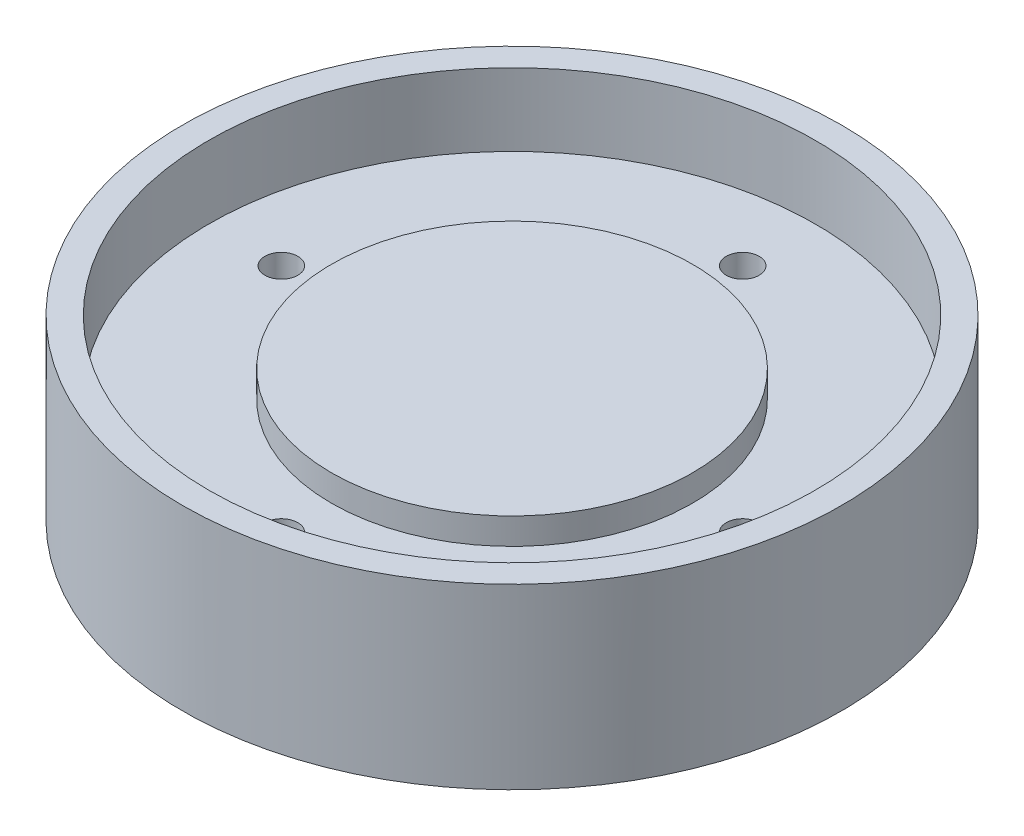
ISO-10303-21;
HEADER;
FILE_DESCRIPTION(('STEP AP214'),'2;1');
FILE_NAME('part.step','',(''),(''),'','','');
FILE_SCHEMA(('AUTOMOTIVE_DESIGN { 1 0 10303 214 1 1 1 1 }'));
ENDSEC;
DATA;
#1=APPLICATION_CONTEXT('core data for automotive mechanical design processes');
#2=APPLICATION_PROTOCOL_DEFINITION('international standard','automotive_design',2000,#1);
#3=PRODUCT_CONTEXT('',#1,'mechanical');
#4=PRODUCT('Part','Part','',(#3));
#5=PRODUCT_RELATED_PRODUCT_CATEGORY('part','',(#4));
#6=PRODUCT_DEFINITION_FORMATION('','',#4);
#7=PRODUCT_DEFINITION_CONTEXT('part definition',#1,'design');
#8=PRODUCT_DEFINITION('design','',#6,#7);
#9=PRODUCT_DEFINITION_SHAPE('','',#8);
#10=(LENGTH_UNIT() NAMED_UNIT(*) SI_UNIT(.MILLI.,.METRE.));
#11=(NAMED_UNIT(*) PLANE_ANGLE_UNIT() SI_UNIT($,.RADIAN.));
#12=(NAMED_UNIT(*) SI_UNIT($,.STERADIAN.) SOLID_ANGLE_UNIT());
#13=UNCERTAINTY_MEASURE_WITH_UNIT(LENGTH_MEASURE(1.E-05),#10,'distance_accuracy_value','');
#14=(GEOMETRIC_REPRESENTATION_CONTEXT(3) GLOBAL_UNCERTAINTY_ASSIGNED_CONTEXT((#13)) GLOBAL_UNIT_ASSIGNED_CONTEXT((#10,
#11,#12)) REPRESENTATION_CONTEXT('',''));
#15=CARTESIAN_POINT('',(0.,0.,0.));
#16=DIRECTION('',(0.,0.,1.));
#17=DIRECTION('',(1.,0.,0.));
#18=AXIS2_PLACEMENT_3D('',#15,#16,#17);
#19=CARTESIAN_POINT('',(0.,0.,0.));
#20=DIRECTION('',(0.,1.,0.));
#21=DIRECTION('',(0.,0.,1.));
#22=AXIS2_PLACEMENT_3D('',#19,#20,#21);
#23=PLANE('',#22);
#24=CARTESIAN_POINT('',(0.,0.,35.));
#25=DIRECTION('',(0.,1.,0.));
#26=DIRECTION('',(0.,0.,1.));
#27=AXIS2_PLACEMENT_3D('',#24,#25,#26);
#28=CIRCLE('',#27,2.5);
#29=CARTESIAN_POINT('',(0.,0.,37.5));
#30=VERTEX_POINT('',#29);
#31=EDGE_CURVE('E57',#30,#30,#28,.T.);
#32=ORIENTED_EDGE('',*,*,#31,.T.);
#33=EDGE_LOOP('',(#32));
#34=FACE_BOUND('',#33,.T.);
#35=CARTESIAN_POINT('',(0.,0.,-35.));
#36=DIRECTION('',(0.,1.,0.));
#37=DIRECTION('',(0.,0.,1.));
#38=AXIS2_PLACEMENT_3D('',#35,#36,#37);
#39=CIRCLE('',#38,2.5);
#40=CARTESIAN_POINT('',(0.,0.,-32.5));
#41=VERTEX_POINT('',#40);
#42=EDGE_CURVE('E61',#41,#41,#39,.T.);
#43=ORIENTED_EDGE('',*,*,#42,.T.);
#44=EDGE_LOOP('',(#43));
#45=FACE_BOUND('',#44,.T.);
#46=CARTESIAN_POINT('',(-35.,0.,0.));
#47=DIRECTION('',(0.,1.,0.));
#48=DIRECTION('',(0.,0.,1.));
#49=AXIS2_PLACEMENT_3D('',#46,#47,#48);
#50=CIRCLE('',#49,2.5);
#51=CARTESIAN_POINT('',(-35.,0.,2.5));
#52=VERTEX_POINT('',#51);
#53=EDGE_CURVE('E64',#52,#52,#50,.T.);
#54=ORIENTED_EDGE('',*,*,#53,.T.);
#55=EDGE_LOOP('',(#54));
#56=FACE_BOUND('',#55,.T.);
#57=CARTESIAN_POINT('',(35.,0.,0.));
#58=DIRECTION('',(0.,1.,0.));
#59=DIRECTION('',(0.,0.,1.));
#60=AXIS2_PLACEMENT_3D('',#57,#58,#59);
#61=CIRCLE('',#60,2.5);
#62=CARTESIAN_POINT('',(35.,0.,2.5));
#63=VERTEX_POINT('',#62);
#64=EDGE_CURVE('E76',#63,#63,#61,.T.);
#65=ORIENTED_EDGE('',*,*,#64,.T.);
#66=EDGE_LOOP('',(#65));
#67=FACE_BOUND('',#66,.T.);
#68=CARTESIAN_POINT('',(0.,0.,0.));
#69=DIRECTION('',(0.,-1.,0.));
#70=DIRECTION('',(0.,0.,-1.));
#71=AXIS2_PLACEMENT_3D('',#68,#69,#70);
#72=CIRCLE('',#71,48.);
#73=CARTESIAN_POINT('',(0.,0.,-48.));
#74=VERTEX_POINT('',#73);
#75=EDGE_CURVE('E119',#74,#74,#72,.T.);
#76=ORIENTED_EDGE('',*,*,#75,.T.);
#77=EDGE_LOOP('',(#76));
#78=FACE_BOUND('',#77,.T.);
#79=ADVANCED_FACE('F37',(#34,#45,#56,#67,#78),#23,.F.);
#80=CARTESIAN_POINT('',(0.,15.,0.));
#81=DIRECTION('',(0.,-1.,0.));
#82=DIRECTION('',(0.,0.,-1.));
#83=AXIS2_PLACEMENT_3D('',#80,#81,#82);
#84=CYLINDRICAL_SURFACE('',#83,50.);
#85=CARTESIAN_POINT('',(0.,15.,0.));
#86=DIRECTION('',(0.,1.,0.));
#87=DIRECTION('',(0.,0.,1.));
#88=AXIS2_PLACEMENT_3D('',#85,#86,#87);
#89=CIRCLE('',#88,50.);
#90=CARTESIAN_POINT('',(0.,15.,50.));
#91=VERTEX_POINT('',#90);
#92=EDGE_CURVE('E10',#91,#91,#89,.T.);
#93=ORIENTED_EDGE('',*,*,#92,.F.);
#94=EDGE_LOOP('',(#93));
#95=FACE_BOUND('',#94,.T.);
#96=CARTESIAN_POINT('',(0.,-12.,0.));
#97=DIRECTION('',(0.,-1.,0.));
#98=DIRECTION('',(0.,0.,-1.));
#99=AXIS2_PLACEMENT_3D('',#96,#97,#98);
#100=CIRCLE('',#99,50.);
#101=CARTESIAN_POINT('',(0.,-12.,-50.));
#102=VERTEX_POINT('',#101);
#103=EDGE_CURVE('E58',#102,#102,#100,.T.);
#104=ORIENTED_EDGE('',*,*,#103,.F.);
#105=EDGE_LOOP('',(#104));
#106=FACE_BOUND('',#105,.T.);
#107=ADVANCED_FACE('F39',(#95,#106),#84,.T.);
#108=CARTESIAN_POINT('',(0.,15.,0.));
#109=DIRECTION('',(0.,1.,0.));
#110=DIRECTION('',(0.,0.,1.));
#111=AXIS2_PLACEMENT_3D('',#108,#109,#110);
#112=PLANE('',#111);
#113=CARTESIAN_POINT('',(0.,15.,0.));
#114=DIRECTION('',(0.,1.,0.));
#115=DIRECTION('',(0.,0.,1.));
#116=AXIS2_PLACEMENT_3D('',#113,#114,#115);
#117=CIRCLE('',#116,46.);
#118=CARTESIAN_POINT('',(0.,15.,46.));
#119=VERTEX_POINT('',#118);
#120=EDGE_CURVE('E45',#119,#119,#117,.T.);
#121=ORIENTED_EDGE('',*,*,#120,.F.);
#122=EDGE_LOOP('',(#121));
#123=FACE_BOUND('',#122,.T.);
#124=ORIENTED_EDGE('',*,*,#92,.T.);
#125=EDGE_LOOP('',(#124));
#126=FACE_BOUND('',#125,.T.);
#127=ADVANCED_FACE('F91',(#123,#126),#112,.T.);
#128=CARTESIAN_POINT('',(0.,15.,0.));
#129=DIRECTION('',(0.,-1.,0.));
#130=DIRECTION('',(0.,0.,-1.));
#131=AXIS2_PLACEMENT_3D('',#128,#129,#130);
#132=CYLINDRICAL_SURFACE('',#131,46.);
#133=ORIENTED_EDGE('',*,*,#120,.T.);
#134=EDGE_LOOP('',(#133));
#135=FACE_BOUND('',#134,.T.);
#136=CARTESIAN_POINT('',(0.,4.,0.));
#137=DIRECTION('',(0.,1.,0.));
#138=DIRECTION('',(0.,0.,1.));
#139=AXIS2_PLACEMENT_3D('',#136,#137,#138);
#140=CIRCLE('',#139,46.);
#141=CARTESIAN_POINT('',(0.,4.,46.));
#142=VERTEX_POINT('',#141);
#143=EDGE_CURVE('E50',#142,#142,#140,.T.);
#144=ORIENTED_EDGE('',*,*,#143,.F.);
#145=EDGE_LOOP('',(#144));
#146=FACE_BOUND('',#145,.T.);
#147=ADVANCED_FACE('F89',(#135,#146),#132,.F.);
#148=CARTESIAN_POINT('',(0.,4.,0.));
#149=DIRECTION('',(0.,1.,0.));
#150=DIRECTION('',(0.,0.,1.));
#151=AXIS2_PLACEMENT_3D('',#148,#149,#150);
#152=PLANE('',#151);
#153=CARTESIAN_POINT('',(35.,4.,0.));
#154=DIRECTION('',(0.,1.,0.));
#155=DIRECTION('',(0.,0.,1.));
#156=AXIS2_PLACEMENT_3D('',#153,#154,#155);
#157=CIRCLE('',#156,2.5);
#158=CARTESIAN_POINT('',(35.,4.,2.5));
#159=VERTEX_POINT('',#158);
#160=EDGE_CURVE('E41',#159,#159,#157,.T.);
#161=ORIENTED_EDGE('',*,*,#160,.F.);
#162=EDGE_LOOP('',(#161));
#163=FACE_BOUND('',#162,.T.);
#164=CARTESIAN_POINT('',(-35.,4.,0.));
#165=DIRECTION('',(0.,1.,0.));
#166=DIRECTION('',(0.,0.,1.));
#167=AXIS2_PLACEMENT_3D('',#164,#165,#166);
#168=CIRCLE('',#167,2.5);
#169=CARTESIAN_POINT('',(-35.,4.,2.5));
#170=VERTEX_POINT('',#169);
#171=EDGE_CURVE('E62',#170,#170,#168,.T.);
#172=ORIENTED_EDGE('',*,*,#171,.F.);
#173=EDGE_LOOP('',(#172));
#174=FACE_BOUND('',#173,.T.);
#175=CARTESIAN_POINT('',(0.,4.,-35.));
#176=DIRECTION('',(0.,1.,0.));
#177=DIRECTION('',(0.,0.,1.));
#178=AXIS2_PLACEMENT_3D('',#175,#176,#177);
#179=CIRCLE('',#178,2.5);
#180=CARTESIAN_POINT('',(0.,4.,-32.5));
#181=VERTEX_POINT('',#180);
#182=EDGE_CURVE('E59',#181,#181,#179,.T.);
#183=ORIENTED_EDGE('',*,*,#182,.F.);
#184=EDGE_LOOP('',(#183));
#185=FACE_BOUND('',#184,.T.);
#186=CARTESIAN_POINT('',(0.,4.,35.));
#187=DIRECTION('',(0.,1.,0.));
#188=DIRECTION('',(0.,0.,1.));
#189=AXIS2_PLACEMENT_3D('',#186,#187,#188);
#190=CIRCLE('',#189,2.5);
#191=CARTESIAN_POINT('',(0.,4.,37.5));
#192=VERTEX_POINT('',#191);
#193=EDGE_CURVE('E54',#192,#192,#190,.T.);
#194=ORIENTED_EDGE('',*,*,#193,.F.);
#195=EDGE_LOOP('',(#194));
#196=FACE_BOUND('',#195,.T.);
#197=CARTESIAN_POINT('',(0.,4.,0.));
#198=DIRECTION('',(0.,1.,0.));
#199=DIRECTION('',(0.,0.,1.));
#200=AXIS2_PLACEMENT_3D('',#197,#198,#199);
#201=CIRCLE('',#200,27.405);
#202=CARTESIAN_POINT('',(0.,4.,27.405));
#203=VERTEX_POINT('',#202);
#204=EDGE_CURVE('E79',#203,#203,#201,.T.);
#205=ORIENTED_EDGE('',*,*,#204,.F.);
#206=EDGE_LOOP('',(#205));
#207=FACE_BOUND('',#206,.T.);
#208=ORIENTED_EDGE('',*,*,#143,.T.);
#209=EDGE_LOOP('',(#208));
#210=FACE_BOUND('',#209,.T.);
#211=ADVANCED_FACE('F87',(#163,#174,#185,#196,#207,#210),#152,.T.);
#212=CARTESIAN_POINT('',(0.,8.,0.));
#213=DIRECTION('',(0.,-1.,0.));
#214=DIRECTION('',(0.,0.,-1.));
#215=AXIS2_PLACEMENT_3D('',#212,#213,#214);
#216=CYLINDRICAL_SURFACE('',#215,27.405);
#217=CARTESIAN_POINT('',(0.,8.,0.));
#218=DIRECTION('',(0.,1.,0.));
#219=DIRECTION('',(0.,0.,1.));
#220=AXIS2_PLACEMENT_3D('',#217,#218,#219);
#221=CIRCLE('',#220,27.405);
#222=CARTESIAN_POINT('',(0.,8.,27.405));
#223=VERTEX_POINT('',#222);
#224=EDGE_CURVE('E80',#223,#223,#221,.T.);
#225=ORIENTED_EDGE('',*,*,#224,.F.);
#226=EDGE_LOOP('',(#225));
#227=FACE_BOUND('',#226,.T.);
#228=ORIENTED_EDGE('',*,*,#204,.T.);
#229=EDGE_LOOP('',(#228));
#230=FACE_BOUND('',#229,.T.);
#231=ADVANCED_FACE('F98',(#227,#230),#216,.T.);
#232=CARTESIAN_POINT('',(0.,8.,0.));
#233=DIRECTION('',(0.,1.,0.));
#234=DIRECTION('',(0.,0.,1.));
#235=AXIS2_PLACEMENT_3D('',#232,#233,#234);
#236=PLANE('',#235);
#237=ORIENTED_EDGE('',*,*,#224,.T.);
#238=EDGE_LOOP('',(#237));
#239=FACE_BOUND('',#238,.T.);
#240=ADVANCED_FACE('F155',(#239),#236,.T.);
#241=CARTESIAN_POINT('',(0.,-4.,35.));
#242=DIRECTION('',(0.,1.,0.));
#243=DIRECTION('',(0.,0.,1.));
#244=AXIS2_PLACEMENT_3D('',#241,#242,#243);
#245=CYLINDRICAL_SURFACE('',#244,2.5);
#246=ORIENTED_EDGE('',*,*,#193,.T.);
#247=EDGE_LOOP('',(#246));
#248=FACE_BOUND('',#247,.T.);
#249=ORIENTED_EDGE('',*,*,#31,.F.);
#250=EDGE_LOOP('',(#249));
#251=FACE_BOUND('',#250,.T.);
#252=ADVANCED_FACE('F151',(#248,#251),#245,.F.);
#253=CARTESIAN_POINT('',(0.,-4.,-35.));
#254=DIRECTION('',(0.,1.,0.));
#255=DIRECTION('',(0.,0.,1.));
#256=AXIS2_PLACEMENT_3D('',#253,#254,#255);
#257=CYLINDRICAL_SURFACE('',#256,2.5);
#258=ORIENTED_EDGE('',*,*,#182,.T.);
#259=EDGE_LOOP('',(#258));
#260=FACE_BOUND('',#259,.T.);
#261=ORIENTED_EDGE('',*,*,#42,.F.);
#262=EDGE_LOOP('',(#261));
#263=FACE_BOUND('',#262,.T.);
#264=ADVANCED_FACE('F148',(#260,#263),#257,.F.);
#265=CARTESIAN_POINT('',(-35.,-4.,0.));
#266=DIRECTION('',(0.,1.,0.));
#267=DIRECTION('',(0.,0.,1.));
#268=AXIS2_PLACEMENT_3D('',#265,#266,#267);
#269=CYLINDRICAL_SURFACE('',#268,2.5);
#270=ORIENTED_EDGE('',*,*,#171,.T.);
#271=EDGE_LOOP('',(#270));
#272=FACE_BOUND('',#271,.T.);
#273=ORIENTED_EDGE('',*,*,#53,.F.);
#274=EDGE_LOOP('',(#273));
#275=FACE_BOUND('',#274,.T.);
#276=ADVANCED_FACE('F144',(#272,#275),#269,.F.);
#277=CARTESIAN_POINT('',(35.,-4.,0.));
#278=DIRECTION('',(0.,1.,0.));
#279=DIRECTION('',(0.,0.,1.));
#280=AXIS2_PLACEMENT_3D('',#277,#278,#279);
#281=CYLINDRICAL_SURFACE('',#280,2.5);
#282=ORIENTED_EDGE('',*,*,#160,.T.);
#283=EDGE_LOOP('',(#282));
#284=FACE_BOUND('',#283,.T.);
#285=ORIENTED_EDGE('',*,*,#64,.F.);
#286=EDGE_LOOP('',(#285));
#287=FACE_BOUND('',#286,.T.);
#288=ADVANCED_FACE('F133',(#284,#287),#281,.F.);
#289=CARTESIAN_POINT('',(0.,-12.,0.));
#290=DIRECTION('',(0.,-1.,0.));
#291=DIRECTION('',(0.,0.,-1.));
#292=AXIS2_PLACEMENT_3D('',#289,#290,#291);
#293=PLANE('',#292);
#294=ORIENTED_EDGE('',*,*,#103,.T.);
#295=EDGE_LOOP('',(#294));
#296=FACE_BOUND('',#295,.T.);
#297=CARTESIAN_POINT('',(0.,-12.,0.));
#298=DIRECTION('',(0.,-1.,0.));
#299=DIRECTION('',(0.,0.,-1.));
#300=AXIS2_PLACEMENT_3D('',#297,#298,#299);
#301=CIRCLE('',#300,48.);
#302=CARTESIAN_POINT('',(0.,-12.,-48.));
#303=VERTEX_POINT('',#302);
#304=EDGE_CURVE('E121',#303,#303,#301,.T.);
#305=ORIENTED_EDGE('',*,*,#304,.F.);
#306=EDGE_LOOP('',(#305));
#307=FACE_BOUND('',#306,.T.);
#308=ADVANCED_FACE('F128',(#296,#307),#293,.T.);
#309=CARTESIAN_POINT('',(0.,-12.,0.));
#310=DIRECTION('',(0.,1.,0.));
#311=DIRECTION('',(0.,0.,1.));
#312=AXIS2_PLACEMENT_3D('',#309,#310,#311);
#313=CYLINDRICAL_SURFACE('',#312,48.);
#314=ORIENTED_EDGE('',*,*,#304,.T.);
#315=EDGE_LOOP('',(#314));
#316=FACE_BOUND('',#315,.T.);
#317=ORIENTED_EDGE('',*,*,#75,.F.);
#318=EDGE_LOOP('',(#317));
#319=FACE_BOUND('',#318,.T.);
#320=ADVANCED_FACE('F132',(#316,#319),#313,.F.);
#321=CLOSED_SHELL('',(#79,#107,#127,#147,#211,#231,#240,#252,#264,#276,#288,#308,#320));
#322=MANIFOLD_SOLID_BREP('B2',#321);
#323=ADVANCED_BREP_SHAPE_REPRESENTATION('',(#18,#322),#14);
#324=SHAPE_DEFINITION_REPRESENTATION(#9,#323);
ENDSEC;
END-ISO-10303-21;
